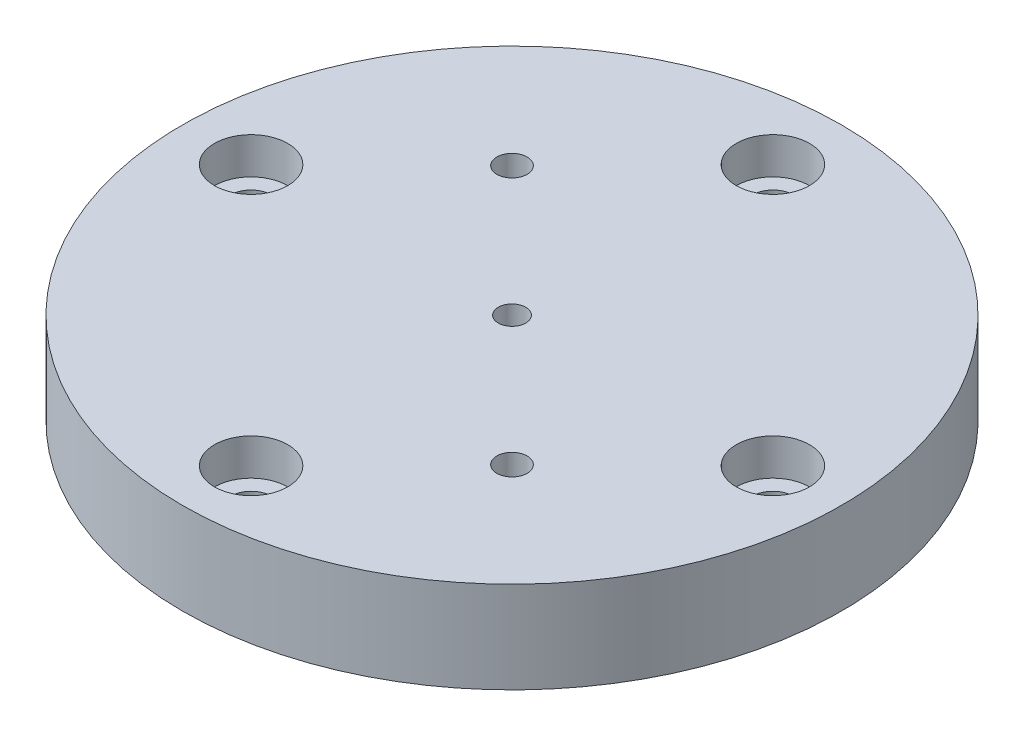
ISO-10303-21;
HEADER;
FILE_DESCRIPTION(('STEP AP214'),'2;1');
FILE_NAME('part.step','',(''),(''),'','','');
FILE_SCHEMA(('AUTOMOTIVE_DESIGN { 1 0 10303 214 1 1 1 1 }'));
ENDSEC;
DATA;
#1=APPLICATION_CONTEXT('core data for automotive mechanical design processes');
#2=APPLICATION_PROTOCOL_DEFINITION('international standard','automotive_design',2000,#1);
#3=PRODUCT_CONTEXT('',#1,'mechanical');
#4=PRODUCT('Part','Part','',(#3));
#5=PRODUCT_RELATED_PRODUCT_CATEGORY('part','',(#4));
#6=PRODUCT_DEFINITION_FORMATION('','',#4);
#7=PRODUCT_DEFINITION_CONTEXT('part definition',#1,'design');
#8=PRODUCT_DEFINITION('design','',#6,#7);
#9=PRODUCT_DEFINITION_SHAPE('','',#8);
#10=(LENGTH_UNIT() NAMED_UNIT(*) SI_UNIT(.MILLI.,.METRE.));
#11=(NAMED_UNIT(*) PLANE_ANGLE_UNIT() SI_UNIT($,.RADIAN.));
#12=(NAMED_UNIT(*) SI_UNIT($,.STERADIAN.) SOLID_ANGLE_UNIT());
#13=UNCERTAINTY_MEASURE_WITH_UNIT(LENGTH_MEASURE(1.E-05),#10,'distance_accuracy_value','');
#14=(GEOMETRIC_REPRESENTATION_CONTEXT(3) GLOBAL_UNCERTAINTY_ASSIGNED_CONTEXT((#13)) GLOBAL_UNIT_ASSIGNED_CONTEXT((#10,
#11,#12)) REPRESENTATION_CONTEXT('',''));
#15=CARTESIAN_POINT('',(0.,0.,0.));
#16=DIRECTION('',(0.,0.,1.));
#17=DIRECTION('',(1.,0.,0.));
#18=AXIS2_PLACEMENT_3D('',#15,#16,#17);
#19=CARTESIAN_POINT('',(0.,0.,0.));
#20=DIRECTION('',(0.,-1.,0.));
#21=DIRECTION('',(0.,0.,-1.));
#22=AXIS2_PLACEMENT_3D('',#19,#20,#21);
#23=PLANE('',#22);
#24=CARTESIAN_POINT('',(0.,0.,0.));
#25=DIRECTION('',(0.,-1.,0.));
#26=DIRECTION('',(0.,0.,-1.));
#27=AXIS2_PLACEMENT_3D('',#24,#25,#26);
#28=CIRCLE('',#27,1.5);
#29=CARTESIAN_POINT('',(0.,0.,-1.5));
#30=VERTEX_POINT('',#29);
#31=EDGE_CURVE('E117',#30,#30,#28,.T.);
#32=ORIENTED_EDGE('',*,*,#31,.F.);
#33=EDGE_LOOP('',(#32));
#34=FACE_BOUND('',#33,.T.);
#35=CARTESIAN_POINT('',(-14.142135623731,0.,-14.1421356237309));
#36=DIRECTION('',(0.,-1.,0.));
#37=DIRECTION('',(0.,0.,-1.));
#38=AXIS2_PLACEMENT_3D('',#35,#36,#37);
#39=CIRCLE('',#38,1.64999999999999);
#40=CARTESIAN_POINT('',(-14.142135623731,0.,-15.7921356237309));
#41=VERTEX_POINT('',#40);
#42=EDGE_CURVE('E121',#41,#41,#39,.T.);
#43=ORIENTED_EDGE('',*,*,#42,.F.);
#44=EDGE_LOOP('',(#43));
#45=FACE_BOUND('',#44,.T.);
#46=CARTESIAN_POINT('',(14.1421356237309,0.,14.142135623731));
#47=DIRECTION('',(0.,-1.,0.));
#48=DIRECTION('',(0.,0.,-1.));
#49=AXIS2_PLACEMENT_3D('',#46,#47,#48);
#50=CIRCLE('',#49,1.64999999999999);
#51=CARTESIAN_POINT('',(14.1421356237309,0.,12.492135623731));
#52=VERTEX_POINT('',#51);
#53=EDGE_CURVE('E125',#52,#52,#50,.T.);
#54=ORIENTED_EDGE('',*,*,#53,.F.);
#55=EDGE_LOOP('',(#54));
#56=FACE_BOUND('',#55,.T.);
#57=CARTESIAN_POINT('',(0.,0.,-28.5));
#58=DIRECTION('',(0.,-1.,0.));
#59=DIRECTION('',(0.,0.,-1.));
#60=AXIS2_PLACEMENT_3D('',#57,#58,#59);
#61=CIRCLE('',#60,2.25);
#62=CARTESIAN_POINT('',(0.,0.,-30.75));
#63=VERTEX_POINT('',#62);
#64=EDGE_CURVE('E35',#63,#63,#61,.T.);
#65=ORIENTED_EDGE('',*,*,#64,.F.);
#66=EDGE_LOOP('',(#65));
#67=FACE_BOUND('',#66,.T.);
#68=CARTESIAN_POINT('',(-28.5,0.,0.));
#69=DIRECTION('',(0.,-1.,0.));
#70=DIRECTION('',(0.,0.,-1.));
#71=AXIS2_PLACEMENT_3D('',#68,#69,#70);
#72=CIRCLE('',#71,2.25);
#73=CARTESIAN_POINT('',(-28.5,0.,-2.25));
#74=VERTEX_POINT('',#73);
#75=EDGE_CURVE('E57',#74,#74,#72,.T.);
#76=ORIENTED_EDGE('',*,*,#75,.F.);
#77=EDGE_LOOP('',(#76));
#78=FACE_BOUND('',#77,.T.);
#79=CARTESIAN_POINT('',(28.5,0.,0.));
#80=DIRECTION('',(0.,-1.,0.));
#81=DIRECTION('',(0.,0.,-1.));
#82=AXIS2_PLACEMENT_3D('',#79,#80,#81);
#83=CIRCLE('',#82,2.25);
#84=CARTESIAN_POINT('',(28.5,0.,-2.25));
#85=VERTEX_POINT('',#84);
#86=EDGE_CURVE('E53',#85,#85,#83,.T.);
#87=ORIENTED_EDGE('',*,*,#86,.F.);
#88=EDGE_LOOP('',(#87));
#89=FACE_BOUND('',#88,.T.);
#90=CARTESIAN_POINT('',(0.,0.,28.5));
#91=DIRECTION('',(0.,-1.,0.));
#92=DIRECTION('',(0.,0.,-1.));
#93=AXIS2_PLACEMENT_3D('',#90,#91,#92);
#94=CIRCLE('',#93,2.25);
#95=CARTESIAN_POINT('',(0.,0.,26.25));
#96=VERTEX_POINT('',#95);
#97=EDGE_CURVE('E48',#96,#96,#94,.T.);
#98=ORIENTED_EDGE('',*,*,#97,.F.);
#99=EDGE_LOOP('',(#98));
#100=FACE_BOUND('',#99,.T.);
#101=CARTESIAN_POINT('',(0.,0.,0.));
#102=DIRECTION('',(0.,-1.,0.));
#103=DIRECTION('',(0.,0.,-1.));
#104=AXIS2_PLACEMENT_3D('',#101,#102,#103);
#105=CIRCLE('',#104,32.);
#106=CARTESIAN_POINT('',(0.,0.,-32.));
#107=VERTEX_POINT('',#106);
#108=EDGE_CURVE('E10',#107,#107,#105,.T.);
#109=ORIENTED_EDGE('',*,*,#108,.T.);
#110=EDGE_LOOP('',(#109));
#111=FACE_BOUND('',#110,.T.);
#112=ADVANCED_FACE('F32',(#34,#45,#56,#67,#78,#89,#100,#111),#23,.T.);
#113=CARTESIAN_POINT('',(0.,-990.217396251422,0.));
#114=DIRECTION('',(0.,-1.,0.));
#115=DIRECTION('',(0.,0.,-1.));
#116=AXIS2_PLACEMENT_3D('',#113,#114,#115);
#117=CYLINDRICAL_SURFACE('',#116,32.);
#118=CARTESIAN_POINT('',(0.,-4.,0.));
#119=DIRECTION('',(0.,-1.,0.));
#120=DIRECTION('',(0.,0.,-1.));
#121=AXIS2_PLACEMENT_3D('',#118,#119,#120);
#122=CIRCLE('',#121,32.);
#123=CARTESIAN_POINT('',(0.,-4.,-32.));
#124=VERTEX_POINT('',#123);
#125=EDGE_CURVE('E39',#124,#124,#122,.T.);
#126=ORIENTED_EDGE('',*,*,#125,.T.);
#127=EDGE_LOOP('',(#126));
#128=FACE_BOUND('',#127,.T.);
#129=ORIENTED_EDGE('',*,*,#108,.F.);
#130=EDGE_LOOP('',(#129));
#131=FACE_BOUND('',#130,.T.);
#132=ADVANCED_FACE('F106',(#128,#131),#117,.F.);
#133=CARTESIAN_POINT('',(32.,-4.,0.));
#134=DIRECTION('',(0.,-1.,0.));
#135=DIRECTION('',(0.,0.,-1.));
#136=AXIS2_PLACEMENT_3D('',#133,#134,#135);
#137=PLANE('',#136);
#138=CARTESIAN_POINT('',(0.,-4.,0.));
#139=DIRECTION('',(0.,-1.,0.));
#140=DIRECTION('',(0.,0.,-1.));
#141=AXIS2_PLACEMENT_3D('',#138,#139,#140);
#142=CIRCLE('',#141,36.);
#143=CARTESIAN_POINT('',(0.,-4.,-36.));
#144=VERTEX_POINT('',#143);
#145=EDGE_CURVE('E44',#144,#144,#142,.T.);
#146=ORIENTED_EDGE('',*,*,#145,.T.);
#147=EDGE_LOOP('',(#146));
#148=FACE_BOUND('',#147,.T.);
#149=ORIENTED_EDGE('',*,*,#125,.F.);
#150=EDGE_LOOP('',(#149));
#151=FACE_BOUND('',#150,.T.);
#152=ADVANCED_FACE('F91',(#148,#151),#137,.T.);
#153=CARTESIAN_POINT('',(0.,-990.217396251422,0.));
#154=DIRECTION('',(0.,-1.,0.));
#155=DIRECTION('',(0.,0.,-1.));
#156=AXIS2_PLACEMENT_3D('',#153,#154,#155);
#157=CYLINDRICAL_SURFACE('',#156,36.);
#158=CARTESIAN_POINT('',(0.,6.00000000000001,0.));
#159=DIRECTION('',(0.,-1.,0.));
#160=DIRECTION('',(0.,0.,-1.));
#161=AXIS2_PLACEMENT_3D('',#158,#159,#160);
#162=CIRCLE('',#161,36.);
#163=CARTESIAN_POINT('',(0.,6.00000000000001,-36.));
#164=VERTEX_POINT('',#163);
#165=EDGE_CURVE('E51',#164,#164,#162,.T.);
#166=ORIENTED_EDGE('',*,*,#165,.T.);
#167=EDGE_LOOP('',(#166));
#168=FACE_BOUND('',#167,.T.);
#169=ORIENTED_EDGE('',*,*,#145,.F.);
#170=EDGE_LOOP('',(#169));
#171=FACE_BOUND('',#170,.T.);
#172=ADVANCED_FACE('F94',(#168,#171),#157,.T.);
#173=CARTESIAN_POINT('',(36.,6.,0.));
#174=DIRECTION('',(0.,1.,0.));
#175=DIRECTION('',(0.,0.,1.));
#176=AXIS2_PLACEMENT_3D('',#173,#174,#175);
#177=PLANE('',#176);
#178=CARTESIAN_POINT('',(0.,6.,0.));
#179=DIRECTION('',(0.,1.,0.));
#180=DIRECTION('',(0.,0.,1.));
#181=AXIS2_PLACEMENT_3D('',#178,#179,#180);
#182=CIRCLE('',#181,1.5);
#183=CARTESIAN_POINT('',(0.,6.,1.5));
#184=VERTEX_POINT('',#183);
#185=EDGE_CURVE('E207',#184,#184,#182,.T.);
#186=ORIENTED_EDGE('',*,*,#185,.F.);
#187=EDGE_LOOP('',(#186));
#188=FACE_BOUND('',#187,.T.);
#189=CARTESIAN_POINT('',(-14.142135623731,6.,-14.1421356237309));
#190=DIRECTION('',(0.,1.,0.));
#191=DIRECTION('',(0.,0.,1.));
#192=AXIS2_PLACEMENT_3D('',#189,#190,#191);
#193=CIRCLE('',#192,1.64999999999999);
#194=CARTESIAN_POINT('',(-14.142135623731,6.,-12.4921356237309));
#195=VERTEX_POINT('',#194);
#196=EDGE_CURVE('E209',#195,#195,#193,.T.);
#197=ORIENTED_EDGE('',*,*,#196,.F.);
#198=EDGE_LOOP('',(#197));
#199=FACE_BOUND('',#198,.T.);
#200=CARTESIAN_POINT('',(14.1421356237309,6.,14.142135623731));
#201=DIRECTION('',(0.,1.,0.));
#202=DIRECTION('',(0.,0.,1.));
#203=AXIS2_PLACEMENT_3D('',#200,#201,#202);
#204=CIRCLE('',#203,1.64999999999999);
#205=CARTESIAN_POINT('',(14.1421356237309,6.,15.7921356237309));
#206=VERTEX_POINT('',#205);
#207=EDGE_CURVE('E215',#206,#206,#204,.T.);
#208=ORIENTED_EDGE('',*,*,#207,.F.);
#209=EDGE_LOOP('',(#208));
#210=FACE_BOUND('',#209,.T.);
#211=CARTESIAN_POINT('',(0.,6.,-28.5));
#212=DIRECTION('',(0.,1.,0.));
#213=DIRECTION('',(0.,0.,1.));
#214=AXIS2_PLACEMENT_3D('',#211,#212,#213);
#215=CIRCLE('',#214,4.);
#216=CARTESIAN_POINT('',(0.,6.,-24.5));
#217=VERTEX_POINT('',#216);
#218=EDGE_CURVE('E219',#217,#217,#215,.T.);
#219=ORIENTED_EDGE('',*,*,#218,.F.);
#220=EDGE_LOOP('',(#219));
#221=FACE_BOUND('',#220,.T.);
#222=CARTESIAN_POINT('',(-28.5,6.,0.));
#223=DIRECTION('',(0.,1.,0.));
#224=DIRECTION('',(0.,0.,1.));
#225=AXIS2_PLACEMENT_3D('',#222,#223,#224);
#226=CIRCLE('',#225,4.);
#227=CARTESIAN_POINT('',(-28.5,6.,4.));
#228=VERTEX_POINT('',#227);
#229=EDGE_CURVE('E72',#228,#228,#226,.T.);
#230=ORIENTED_EDGE('',*,*,#229,.F.);
#231=EDGE_LOOP('',(#230));
#232=FACE_BOUND('',#231,.T.);
#233=CARTESIAN_POINT('',(28.5,6.,0.));
#234=DIRECTION('',(0.,1.,0.));
#235=DIRECTION('',(0.,0.,1.));
#236=AXIS2_PLACEMENT_3D('',#233,#234,#235);
#237=CIRCLE('',#236,4.);
#238=CARTESIAN_POINT('',(28.5,6.,4.));
#239=VERTEX_POINT('',#238);
#240=EDGE_CURVE('E59',#239,#239,#237,.T.);
#241=ORIENTED_EDGE('',*,*,#240,.F.);
#242=EDGE_LOOP('',(#241));
#243=FACE_BOUND('',#242,.T.);
#244=CARTESIAN_POINT('',(0.,6.,28.5));
#245=DIRECTION('',(0.,1.,0.));
#246=DIRECTION('',(0.,0.,1.));
#247=AXIS2_PLACEMENT_3D('',#244,#245,#246);
#248=CIRCLE('',#247,4.);
#249=CARTESIAN_POINT('',(0.,6.,32.5));
#250=VERTEX_POINT('',#249);
#251=EDGE_CURVE('E55',#250,#250,#248,.T.);
#252=ORIENTED_EDGE('',*,*,#251,.F.);
#253=EDGE_LOOP('',(#252));
#254=FACE_BOUND('',#253,.T.);
#255=ORIENTED_EDGE('',*,*,#165,.F.);
#256=EDGE_LOOP('',(#255));
#257=FACE_BOUND('',#256,.T.);
#258=ADVANCED_FACE('F96',(#188,#199,#210,#221,#232,#243,#254,#257),#177,.T.);
#259=CARTESIAN_POINT('',(0.,6.,28.5));
#260=DIRECTION('',(0.,1.,0.));
#261=DIRECTION('',(0.,0.,1.));
#262=AXIS2_PLACEMENT_3D('',#259,#260,#261);
#263=CYLINDRICAL_SURFACE('',#262,2.25);
#264=ORIENTED_EDGE('',*,*,#97,.T.);
#265=EDGE_LOOP('',(#264));
#266=FACE_BOUND('',#265,.T.);
#267=CARTESIAN_POINT('',(0.,2.,28.5));
#268=DIRECTION('',(0.,1.,0.));
#269=DIRECTION('',(0.,0.,1.));
#270=AXIS2_PLACEMENT_3D('',#267,#268,#269);
#271=CIRCLE('',#270,2.25);
#272=CARTESIAN_POINT('',(0.,2.,30.75));
#273=VERTEX_POINT('',#272);
#274=EDGE_CURVE('E52',#273,#273,#271,.T.);
#275=ORIENTED_EDGE('',*,*,#274,.T.);
#276=EDGE_LOOP('',(#275));
#277=FACE_BOUND('',#276,.T.);
#278=ADVANCED_FACE('F103',(#266,#277),#263,.F.);
#279=CARTESIAN_POINT('',(2.25,2.,28.5));
#280=DIRECTION('',(0.,-1.,0.));
#281=DIRECTION('',(0.,0.,-1.));
#282=AXIS2_PLACEMENT_3D('',#279,#280,#281);
#283=PLANE('',#282);
#284=ORIENTED_EDGE('',*,*,#274,.F.);
#285=EDGE_LOOP('',(#284));
#286=FACE_BOUND('',#285,.T.);
#287=CARTESIAN_POINT('',(0.,2.,28.5));
#288=DIRECTION('',(0.,1.,0.));
#289=DIRECTION('',(0.,0.,1.));
#290=AXIS2_PLACEMENT_3D('',#287,#288,#289);
#291=CIRCLE('',#290,4.);
#292=CARTESIAN_POINT('',(0.,2.,32.5));
#293=VERTEX_POINT('',#292);
#294=EDGE_CURVE('E82',#293,#293,#291,.T.);
#295=ORIENTED_EDGE('',*,*,#294,.T.);
#296=EDGE_LOOP('',(#295));
#297=FACE_BOUND('',#296,.T.);
#298=ADVANCED_FACE('F136',(#286,#297),#283,.F.);
#299=CARTESIAN_POINT('',(0.,6.,28.5));
#300=DIRECTION('',(0.,1.,0.));
#301=DIRECTION('',(0.,0.,1.));
#302=AXIS2_PLACEMENT_3D('',#299,#300,#301);
#303=CYLINDRICAL_SURFACE('',#302,4.);
#304=ORIENTED_EDGE('',*,*,#294,.F.);
#305=EDGE_LOOP('',(#304));
#306=FACE_BOUND('',#305,.T.);
#307=ORIENTED_EDGE('',*,*,#251,.T.);
#308=EDGE_LOOP('',(#307));
#309=FACE_BOUND('',#308,.T.);
#310=ADVANCED_FACE('F142',(#306,#309),#303,.F.);
#311=CARTESIAN_POINT('',(28.5,6.,0.));
#312=DIRECTION('',(0.,1.,0.));
#313=DIRECTION('',(0.,0.,1.));
#314=AXIS2_PLACEMENT_3D('',#311,#312,#313);
#315=CYLINDRICAL_SURFACE('',#314,2.25);
#316=ORIENTED_EDGE('',*,*,#86,.T.);
#317=EDGE_LOOP('',(#316));
#318=FACE_BOUND('',#317,.T.);
#319=CARTESIAN_POINT('',(28.5,2.,0.));
#320=DIRECTION('',(0.,1.,0.));
#321=DIRECTION('',(0.,0.,1.));
#322=AXIS2_PLACEMENT_3D('',#319,#320,#321);
#323=CIRCLE('',#322,2.25);
#324=CARTESIAN_POINT('',(28.5,2.,2.25));
#325=VERTEX_POINT('',#324);
#326=EDGE_CURVE('E56',#325,#325,#323,.T.);
#327=ORIENTED_EDGE('',*,*,#326,.T.);
#328=EDGE_LOOP('',(#327));
#329=FACE_BOUND('',#328,.T.);
#330=ADVANCED_FACE('F148',(#318,#329),#315,.F.);
#331=CARTESIAN_POINT('',(30.75,2.,0.));
#332=DIRECTION('',(0.,-1.,0.));
#333=DIRECTION('',(0.,0.,-1.));
#334=AXIS2_PLACEMENT_3D('',#331,#332,#333);
#335=PLANE('',#334);
#336=ORIENTED_EDGE('',*,*,#326,.F.);
#337=EDGE_LOOP('',(#336));
#338=FACE_BOUND('',#337,.T.);
#339=CARTESIAN_POINT('',(28.5,2.,0.));
#340=DIRECTION('',(0.,1.,0.));
#341=DIRECTION('',(0.,0.,1.));
#342=AXIS2_PLACEMENT_3D('',#339,#340,#341);
#343=CIRCLE('',#342,4.);
#344=CARTESIAN_POINT('',(28.5,2.,4.));
#345=VERTEX_POINT('',#344);
#346=EDGE_CURVE('E64',#345,#345,#343,.T.);
#347=ORIENTED_EDGE('',*,*,#346,.T.);
#348=EDGE_LOOP('',(#347));
#349=FACE_BOUND('',#348,.T.);
#350=ADVANCED_FACE('F157',(#338,#349),#335,.F.);
#351=CARTESIAN_POINT('',(28.5,6.,0.));
#352=DIRECTION('',(0.,1.,0.));
#353=DIRECTION('',(0.,0.,1.));
#354=AXIS2_PLACEMENT_3D('',#351,#352,#353);
#355=CYLINDRICAL_SURFACE('',#354,4.);
#356=ORIENTED_EDGE('',*,*,#346,.F.);
#357=EDGE_LOOP('',(#356));
#358=FACE_BOUND('',#357,.T.);
#359=ORIENTED_EDGE('',*,*,#240,.T.);
#360=EDGE_LOOP('',(#359));
#361=FACE_BOUND('',#360,.T.);
#362=ADVANCED_FACE('F163',(#358,#361),#355,.F.);
#363=CARTESIAN_POINT('',(-28.5,6.,0.));
#364=DIRECTION('',(0.,1.,0.));
#365=DIRECTION('',(0.,0.,1.));
#366=AXIS2_PLACEMENT_3D('',#363,#364,#365);
#367=CYLINDRICAL_SURFACE('',#366,2.25);
#368=ORIENTED_EDGE('',*,*,#75,.T.);
#369=EDGE_LOOP('',(#368));
#370=FACE_BOUND('',#369,.T.);
#371=CARTESIAN_POINT('',(-28.5,2.,0.));
#372=DIRECTION('',(0.,1.,0.));
#373=DIRECTION('',(0.,0.,1.));
#374=AXIS2_PLACEMENT_3D('',#371,#372,#373);
#375=CIRCLE('',#374,2.25);
#376=CARTESIAN_POINT('',(-28.5,2.,2.25));
#377=VERTEX_POINT('',#376);
#378=EDGE_CURVE('E60',#377,#377,#375,.T.);
#379=ORIENTED_EDGE('',*,*,#378,.T.);
#380=EDGE_LOOP('',(#379));
#381=FACE_BOUND('',#380,.T.);
#382=ADVANCED_FACE('F167',(#370,#381),#367,.F.);
#383=CARTESIAN_POINT('',(-26.25,2.,0.));
#384=DIRECTION('',(0.,-1.,0.));
#385=DIRECTION('',(0.,0.,-1.));
#386=AXIS2_PLACEMENT_3D('',#383,#384,#385);
#387=PLANE('',#386);
#388=ORIENTED_EDGE('',*,*,#378,.F.);
#389=EDGE_LOOP('',(#388));
#390=FACE_BOUND('',#389,.T.);
#391=CARTESIAN_POINT('',(-28.5,2.,0.));
#392=DIRECTION('',(0.,1.,0.));
#393=DIRECTION('',(0.,0.,1.));
#394=AXIS2_PLACEMENT_3D('',#391,#392,#393);
#395=CIRCLE('',#394,4.);
#396=CARTESIAN_POINT('',(-28.5,2.,4.));
#397=VERTEX_POINT('',#396);
#398=EDGE_CURVE('E67',#397,#397,#395,.T.);
#399=ORIENTED_EDGE('',*,*,#398,.T.);
#400=EDGE_LOOP('',(#399));
#401=FACE_BOUND('',#400,.T.);
#402=ADVANCED_FACE('F171',(#390,#401),#387,.F.);
#403=CARTESIAN_POINT('',(-28.5,6.,0.));
#404=DIRECTION('',(0.,1.,0.));
#405=DIRECTION('',(0.,0.,1.));
#406=AXIS2_PLACEMENT_3D('',#403,#404,#405);
#407=CYLINDRICAL_SURFACE('',#406,4.);
#408=ORIENTED_EDGE('',*,*,#398,.F.);
#409=EDGE_LOOP('',(#408));
#410=FACE_BOUND('',#409,.T.);
#411=ORIENTED_EDGE('',*,*,#229,.T.);
#412=EDGE_LOOP('',(#411));
#413=FACE_BOUND('',#412,.T.);
#414=ADVANCED_FACE('F174',(#410,#413),#407,.F.);
#415=CARTESIAN_POINT('',(0.,6.,-28.5));
#416=DIRECTION('',(0.,1.,0.));
#417=DIRECTION('',(0.,0.,1.));
#418=AXIS2_PLACEMENT_3D('',#415,#416,#417);
#419=CYLINDRICAL_SURFACE('',#418,2.25);
#420=ORIENTED_EDGE('',*,*,#64,.T.);
#421=EDGE_LOOP('',(#420));
#422=FACE_BOUND('',#421,.T.);
#423=CARTESIAN_POINT('',(0.,2.,-28.5));
#424=DIRECTION('',(0.,1.,0.));
#425=DIRECTION('',(0.,0.,1.));
#426=AXIS2_PLACEMENT_3D('',#423,#424,#425);
#427=CIRCLE('',#426,2.25);
#428=CARTESIAN_POINT('',(0.,2.,-26.25));
#429=VERTEX_POINT('',#428);
#430=EDGE_CURVE('E225',#429,#429,#427,.T.);
#431=ORIENTED_EDGE('',*,*,#430,.T.);
#432=EDGE_LOOP('',(#431));
#433=FACE_BOUND('',#432,.T.);
#434=ADVANCED_FACE('F178',(#422,#433),#419,.F.);
#435=CARTESIAN_POINT('',(2.25,2.,-28.5));
#436=DIRECTION('',(0.,-1.,0.));
#437=DIRECTION('',(0.,0.,-1.));
#438=AXIS2_PLACEMENT_3D('',#435,#436,#437);
#439=PLANE('',#438);
#440=ORIENTED_EDGE('',*,*,#430,.F.);
#441=EDGE_LOOP('',(#440));
#442=FACE_BOUND('',#441,.T.);
#443=CARTESIAN_POINT('',(0.,2.,-28.5));
#444=DIRECTION('',(0.,1.,0.));
#445=DIRECTION('',(0.,0.,1.));
#446=AXIS2_PLACEMENT_3D('',#443,#444,#445);
#447=CIRCLE('',#446,4.);
#448=CARTESIAN_POINT('',(0.,2.,-24.5));
#449=VERTEX_POINT('',#448);
#450=EDGE_CURVE('E222',#449,#449,#447,.T.);
#451=ORIENTED_EDGE('',*,*,#450,.T.);
#452=EDGE_LOOP('',(#451));
#453=FACE_BOUND('',#452,.T.);
#454=ADVANCED_FACE('F182',(#442,#453),#439,.F.);
#455=CARTESIAN_POINT('',(0.,6.,-28.5));
#456=DIRECTION('',(0.,1.,0.));
#457=DIRECTION('',(0.,0.,1.));
#458=AXIS2_PLACEMENT_3D('',#455,#456,#457);
#459=CYLINDRICAL_SURFACE('',#458,4.);
#460=ORIENTED_EDGE('',*,*,#450,.F.);
#461=EDGE_LOOP('',(#460));
#462=FACE_BOUND('',#461,.T.);
#463=ORIENTED_EDGE('',*,*,#218,.T.);
#464=EDGE_LOOP('',(#463));
#465=FACE_BOUND('',#464,.T.);
#466=ADVANCED_FACE('F186',(#462,#465),#459,.F.);
#467=CARTESIAN_POINT('',(14.1421356237309,6.,14.142135623731));
#468=DIRECTION('',(0.,1.,0.));
#469=DIRECTION('',(0.,0.,1.));
#470=AXIS2_PLACEMENT_3D('',#467,#468,#469);
#471=CYLINDRICAL_SURFACE('',#470,1.64999999999999);
#472=ORIENTED_EDGE('',*,*,#53,.T.);
#473=EDGE_LOOP('',(#472));
#474=FACE_BOUND('',#473,.T.);
#475=ORIENTED_EDGE('',*,*,#207,.T.);
#476=EDGE_LOOP('',(#475));
#477=FACE_BOUND('',#476,.T.);
#478=ADVANCED_FACE('F190',(#474,#477),#471,.F.);
#479=CARTESIAN_POINT('',(-14.142135623731,6.,-14.1421356237309));
#480=DIRECTION('',(0.,1.,0.));
#481=DIRECTION('',(0.,0.,1.));
#482=AXIS2_PLACEMENT_3D('',#479,#480,#481);
#483=CYLINDRICAL_SURFACE('',#482,1.64999999999999);
#484=ORIENTED_EDGE('',*,*,#42,.T.);
#485=EDGE_LOOP('',(#484));
#486=FACE_BOUND('',#485,.T.);
#487=ORIENTED_EDGE('',*,*,#196,.T.);
#488=EDGE_LOOP('',(#487));
#489=FACE_BOUND('',#488,.T.);
#490=ADVANCED_FACE('F194',(#486,#489),#483,.F.);
#491=CARTESIAN_POINT('',(0.,-4.,0.));
#492=DIRECTION('',(0.,1.,0.));
#493=DIRECTION('',(0.,0.,1.));
#494=AXIS2_PLACEMENT_3D('',#491,#492,#493);
#495=CYLINDRICAL_SURFACE('',#494,1.5);
#496=ORIENTED_EDGE('',*,*,#31,.T.);
#497=EDGE_LOOP('',(#496));
#498=FACE_BOUND('',#497,.T.);
#499=ORIENTED_EDGE('',*,*,#185,.T.);
#500=EDGE_LOOP('',(#499));
#501=FACE_BOUND('',#500,.T.);
#502=ADVANCED_FACE('F198',(#498,#501),#495,.F.);
#503=CLOSED_SHELL('',(#112,#132,#152,#172,#258,#278,#298,#310,#330,#350,#362,#382,#402,#414,
#434,#454,#466,#478,#490,#502));
#504=MANIFOLD_SOLID_BREP('B2',#503);
#505=ADVANCED_BREP_SHAPE_REPRESENTATION('',(#18,#504),#14);
#506=SHAPE_DEFINITION_REPRESENTATION(#9,#505);
ENDSEC;
END-ISO-10303-21;
